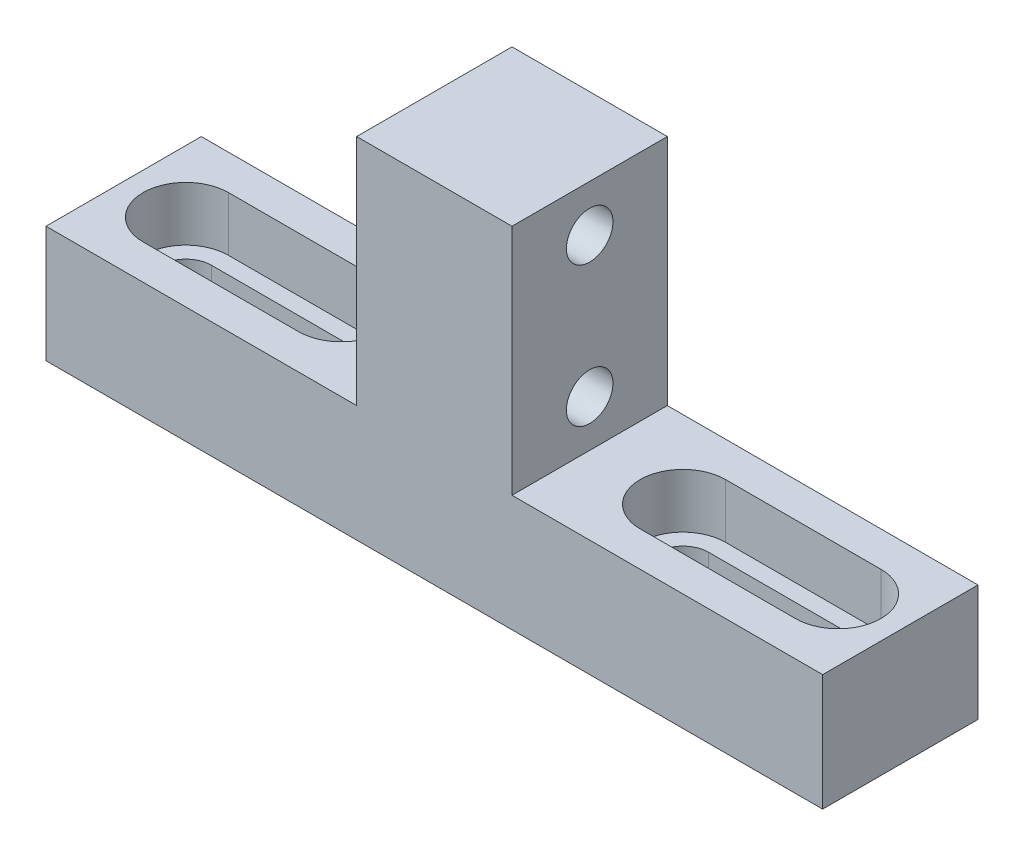
ISO-10303-21;
HEADER;
FILE_DESCRIPTION(('STEP AP214'),'2;1');
FILE_NAME('part.step','',(''),(''),'','','');
FILE_SCHEMA(('AUTOMOTIVE_DESIGN { 1 0 10303 214 1 1 1 1 }'));
ENDSEC;
DATA;
#1=APPLICATION_CONTEXT('core data for automotive mechanical design processes');
#2=APPLICATION_PROTOCOL_DEFINITION('international standard','automotive_design',2000,#1);
#3=PRODUCT_CONTEXT('',#1,'mechanical');
#4=PRODUCT('Part','Part','',(#3));
#5=PRODUCT_RELATED_PRODUCT_CATEGORY('part','',(#4));
#6=PRODUCT_DEFINITION_FORMATION('','',#4);
#7=PRODUCT_DEFINITION_CONTEXT('part definition',#1,'design');
#8=PRODUCT_DEFINITION('design','',#6,#7);
#9=PRODUCT_DEFINITION_SHAPE('','',#8);
#10=(LENGTH_UNIT() NAMED_UNIT(*) SI_UNIT(.MILLI.,.METRE.));
#11=(NAMED_UNIT(*) PLANE_ANGLE_UNIT() SI_UNIT($,.RADIAN.));
#12=(NAMED_UNIT(*) SI_UNIT($,.STERADIAN.) SOLID_ANGLE_UNIT());
#13=UNCERTAINTY_MEASURE_WITH_UNIT(LENGTH_MEASURE(1.E-05),#10,'distance_accuracy_value','');
#14=(GEOMETRIC_REPRESENTATION_CONTEXT(3) GLOBAL_UNCERTAINTY_ASSIGNED_CONTEXT((#13)) GLOBAL_UNIT_ASSIGNED_CONTEXT((#10,
#11,#12)) REPRESENTATION_CONTEXT('',''));
#15=CARTESIAN_POINT('',(0.,0.,0.));
#16=DIRECTION('',(0.,0.,1.));
#17=DIRECTION('',(1.,0.,0.));
#18=AXIS2_PLACEMENT_3D('',#15,#16,#17);
#19=CARTESIAN_POINT('',(0.,15.,0.));
#20=DIRECTION('',(0.,-1.,0.));
#21=DIRECTION('',(0.,0.,-1.));
#22=AXIS2_PLACEMENT_3D('',#19,#20,#21);
#23=PLANE('',#22);
#24=DIRECTION('',(0.,0.,-1.));
#25=VECTOR('',#24,1.);
#26=CARTESIAN_POINT('',(10.,15.,10.));
#27=LINE('',#26,#25);
#28=CARTESIAN_POINT('',(10.,15.,10.));
#29=VERTEX_POINT('',#28);
#30=CARTESIAN_POINT('',(10.,15.,-10.));
#31=VERTEX_POINT('',#30);
#32=EDGE_CURVE('E271',#29,#31,#27,.T.);
#33=ORIENTED_EDGE('',*,*,#32,.F.);
#34=DIRECTION('',(1.,0.,0.));
#35=VECTOR('',#34,1.);
#36=CARTESIAN_POINT('',(-50.,15.,10.));
#37=LINE('',#36,#35);
#38=CARTESIAN_POINT('',(50.,15.,10.));
#39=VERTEX_POINT('',#38);
#40=EDGE_CURVE('E360',#29,#39,#37,.T.);
#41=ORIENTED_EDGE('',*,*,#40,.T.);
#42=DIRECTION('',(0.,0.,-1.));
#43=VECTOR('',#42,1.);
#44=CARTESIAN_POINT('',(50.,15.,10.));
#45=LINE('',#44,#43);
#46=CARTESIAN_POINT('',(50.,15.,-10.));
#47=VERTEX_POINT('',#46);
#48=EDGE_CURVE('E343',#39,#47,#45,.T.);
#49=ORIENTED_EDGE('',*,*,#48,.T.);
#50=DIRECTION('',(-1.,0.,0.));
#51=VECTOR('',#50,1.);
#52=CARTESIAN_POINT('',(-50.,15.,-10.));
#53=LINE('',#52,#51);
#54=EDGE_CURVE('E352',#47,#31,#53,.T.);
#55=ORIENTED_EDGE('',*,*,#54,.T.);
#56=EDGE_LOOP('',(#33,#41,#49,#55));
#57=FACE_BOUND('',#56,.T.);
#58=CARTESIAN_POINT('',(22.,15.,0.));
#59=DIRECTION('',(0.,-1.,0.));
#60=DIRECTION('',(0.,0.,1.));
#61=AXIS2_PLACEMENT_3D('',#58,#59,#60);
#62=CIRCLE('',#61,5.5);
#63=CARTESIAN_POINT('',(22.,15.,5.5));
#64=VERTEX_POINT('',#63);
#65=CARTESIAN_POINT('',(22.,15.,-5.5));
#66=VERTEX_POINT('',#65);
#67=EDGE_CURVE('E34',#64,#66,#62,.T.);
#68=ORIENTED_EDGE('',*,*,#67,.T.);
#69=DIRECTION('',(1.,0.,0.));
#70=VECTOR('',#69,1.);
#71=CARTESIAN_POINT('',(22.,15.,-5.5));
#72=LINE('',#71,#70);
#73=CARTESIAN_POINT('',(42.,15.,-5.5));
#74=VERTEX_POINT('',#73);
#75=EDGE_CURVE('E497',#66,#74,#72,.T.);
#76=ORIENTED_EDGE('',*,*,#75,.T.);
#77=CARTESIAN_POINT('',(42.,15.,0.));
#78=DIRECTION('',(0.,-1.,0.));
#79=DIRECTION('',(0.,0.,1.));
#80=AXIS2_PLACEMENT_3D('',#77,#78,#79);
#81=CIRCLE('',#80,5.5);
#82=CARTESIAN_POINT('',(42.,15.,5.5));
#83=VERTEX_POINT('',#82);
#84=EDGE_CURVE('E501',#74,#83,#81,.T.);
#85=ORIENTED_EDGE('',*,*,#84,.T.);
#86=DIRECTION('',(-1.,0.,0.));
#87=VECTOR('',#86,1.);
#88=CARTESIAN_POINT('',(42.,15.,5.5));
#89=LINE('',#88,#87);
#90=EDGE_CURVE('E504',#83,#64,#89,.T.);
#91=ORIENTED_EDGE('',*,*,#90,.T.);
#92=EDGE_LOOP('',(#68,#76,#85,#91));
#93=FACE_BOUND('',#92,.T.);
#94=ADVANCED_FACE('F17',(#57,#93),#23,.F.);
#95=CARTESIAN_POINT('',(42.,0.,0.));
#96=DIRECTION('',(0.,1.,0.));
#97=DIRECTION('',(0.,0.,1.));
#98=AXIS2_PLACEMENT_3D('',#95,#96,#97);
#99=CYLINDRICAL_SURFACE('',#98,3.3);
#100=DIRECTION('',(0.,1.,0.));
#101=VECTOR('',#100,1.);
#102=CARTESIAN_POINT('',(42.,0.,3.3));
#103=LINE('',#102,#101);
#104=CARTESIAN_POINT('',(42.,0.,3.3));
#105=VERTEX_POINT('',#104);
#106=CARTESIAN_POINT('',(42.,8.,3.3));
#107=VERTEX_POINT('',#106);
#108=EDGE_CURVE('E202',#105,#107,#103,.T.);
#109=ORIENTED_EDGE('',*,*,#108,.T.);
#110=CARTESIAN_POINT('',(42.,8.,0.));
#111=DIRECTION('',(0.,-1.,0.));
#112=DIRECTION('',(0.,0.,1.));
#113=AXIS2_PLACEMENT_3D('',#110,#111,#112);
#114=CIRCLE('',#113,3.3);
#115=CARTESIAN_POINT('',(42.,8.,-3.3));
#116=VERTEX_POINT('',#115);
#117=EDGE_CURVE('E183',#116,#107,#114,.T.);
#118=ORIENTED_EDGE('',*,*,#117,.F.);
#119=DIRECTION('',(0.,1.,0.));
#120=VECTOR('',#119,1.);
#121=CARTESIAN_POINT('',(42.,0.,-3.3));
#122=LINE('',#121,#120);
#123=CARTESIAN_POINT('',(42.,0.,-3.3));
#124=VERTEX_POINT('',#123);
#125=EDGE_CURVE('E206',#124,#116,#122,.T.);
#126=ORIENTED_EDGE('',*,*,#125,.F.);
#127=CARTESIAN_POINT('',(42.,0.,0.));
#128=DIRECTION('',(0.,-1.,0.));
#129=DIRECTION('',(0.,0.,1.));
#130=AXIS2_PLACEMENT_3D('',#127,#128,#129);
#131=CIRCLE('',#130,3.3);
#132=EDGE_CURVE('E481',#124,#105,#131,.T.);
#133=ORIENTED_EDGE('',*,*,#132,.T.);
#134=EDGE_LOOP('',(#109,#118,#126,#133));
#135=FACE_BOUND('',#134,.T.);
#136=ADVANCED_FACE('F406',(#135),#99,.F.);
#137=CARTESIAN_POINT('',(42.,0.,3.3));
#138=DIRECTION('',(0.,0.,-1.));
#139=DIRECTION('',(-1.,0.,0.));
#140=AXIS2_PLACEMENT_3D('',#137,#138,#139);
#141=PLANE('',#140);
#142=DIRECTION('',(0.,1.,0.));
#143=VECTOR('',#142,1.);
#144=CARTESIAN_POINT('',(22.,0.,3.3));
#145=LINE('',#144,#143);
#146=CARTESIAN_POINT('',(22.,0.,3.3));
#147=VERTEX_POINT('',#146);
#148=CARTESIAN_POINT('',(22.,8.,3.3));
#149=VERTEX_POINT('',#148);
#150=EDGE_CURVE('E194',#147,#149,#145,.T.);
#151=ORIENTED_EDGE('',*,*,#150,.T.);
#152=DIRECTION('',(-1.,0.,0.));
#153=VECTOR('',#152,1.);
#154=CARTESIAN_POINT('',(42.,8.,3.3));
#155=LINE('',#154,#153);
#156=EDGE_CURVE('E180',#107,#149,#155,.T.);
#157=ORIENTED_EDGE('',*,*,#156,.F.);
#158=ORIENTED_EDGE('',*,*,#108,.F.);
#159=DIRECTION('',(-1.,0.,0.));
#160=VECTOR('',#159,1.);
#161=CARTESIAN_POINT('',(42.,0.,3.3));
#162=LINE('',#161,#160);
#163=EDGE_CURVE('E201',#105,#147,#162,.T.);
#164=ORIENTED_EDGE('',*,*,#163,.T.);
#165=EDGE_LOOP('',(#151,#157,#158,#164));
#166=FACE_BOUND('',#165,.T.);
#167=ADVANCED_FACE('F199',(#166),#141,.T.);
#168=CARTESIAN_POINT('',(22.,0.,0.));
#169=DIRECTION('',(0.,1.,0.));
#170=DIRECTION('',(0.,0.,1.));
#171=AXIS2_PLACEMENT_3D('',#168,#169,#170);
#172=CYLINDRICAL_SURFACE('',#171,3.3);
#173=DIRECTION('',(0.,1.,0.));
#174=VECTOR('',#173,1.);
#175=CARTESIAN_POINT('',(22.,0.,-3.3));
#176=LINE('',#175,#174);
#177=CARTESIAN_POINT('',(22.,0.,-3.3));
#178=VERTEX_POINT('',#177);
#179=CARTESIAN_POINT('',(22.,8.,-3.3));
#180=VERTEX_POINT('',#179);
#181=EDGE_CURVE('E196',#178,#180,#176,.T.);
#182=ORIENTED_EDGE('',*,*,#181,.T.);
#183=CARTESIAN_POINT('',(22.,8.,0.));
#184=DIRECTION('',(0.,-1.,0.));
#185=DIRECTION('',(0.,0.,1.));
#186=AXIS2_PLACEMENT_3D('',#183,#184,#185);
#187=CIRCLE('',#186,3.3);
#188=EDGE_CURVE('E42',#149,#180,#187,.T.);
#189=ORIENTED_EDGE('',*,*,#188,.F.);
#190=ORIENTED_EDGE('',*,*,#150,.F.);
#191=CARTESIAN_POINT('',(22.,0.,0.));
#192=DIRECTION('',(0.,-1.,0.));
#193=DIRECTION('',(0.,0.,1.));
#194=AXIS2_PLACEMENT_3D('',#191,#192,#193);
#195=CIRCLE('',#194,3.3);
#196=EDGE_CURVE('E482',#147,#178,#195,.T.);
#197=ORIENTED_EDGE('',*,*,#196,.T.);
#198=EDGE_LOOP('',(#182,#189,#190,#197));
#199=FACE_BOUND('',#198,.T.);
#200=ADVANCED_FACE('F192',(#199),#172,.F.);
#201=CARTESIAN_POINT('',(42.,0.,-3.3));
#202=DIRECTION('',(0.,0.,1.));
#203=DIRECTION('',(1.,0.,0.));
#204=AXIS2_PLACEMENT_3D('',#201,#202,#203);
#205=PLANE('',#204);
#206=ORIENTED_EDGE('',*,*,#125,.T.);
#207=DIRECTION('',(1.,0.,0.));
#208=VECTOR('',#207,1.);
#209=CARTESIAN_POINT('',(22.,8.,-3.3));
#210=LINE('',#209,#208);
#211=EDGE_CURVE('E508',#180,#116,#210,.T.);
#212=ORIENTED_EDGE('',*,*,#211,.F.);
#213=ORIENTED_EDGE('',*,*,#181,.F.);
#214=DIRECTION('',(1.,0.,0.));
#215=VECTOR('',#214,1.);
#216=CARTESIAN_POINT('',(42.,0.,-3.3));
#217=LINE('',#216,#215);
#218=EDGE_CURVE('E483',#178,#124,#217,.T.);
#219=ORIENTED_EDGE('',*,*,#218,.T.);
#220=EDGE_LOOP('',(#206,#212,#213,#219));
#221=FACE_BOUND('',#220,.T.);
#222=ADVANCED_FACE('F473',(#221),#205,.T.);
#223=CARTESIAN_POINT('',(0.,0.,0.));
#224=DIRECTION('',(0.,-1.,0.));
#225=DIRECTION('',(0.,0.,-1.));
#226=AXIS2_PLACEMENT_3D('',#223,#224,#225);
#227=PLANE('',#226);
#228=DIRECTION('',(0.,0.,-1.));
#229=VECTOR('',#228,1.);
#230=CARTESIAN_POINT('',(50.,0.,10.));
#231=LINE('',#230,#229);
#232=CARTESIAN_POINT('',(50.,0.,10.));
#233=VERTEX_POINT('',#232);
#234=CARTESIAN_POINT('',(50.,0.,-10.));
#235=VERTEX_POINT('',#234);
#236=EDGE_CURVE('E324',#233,#235,#231,.T.);
#237=ORIENTED_EDGE('',*,*,#236,.F.);
#238=DIRECTION('',(1.,0.,0.));
#239=VECTOR('',#238,1.);
#240=CARTESIAN_POINT('',(-50.,0.,10.));
#241=LINE('',#240,#239);
#242=CARTESIAN_POINT('',(-50.,0.,10.));
#243=VERTEX_POINT('',#242);
#244=EDGE_CURVE('E341',#243,#233,#241,.T.);
#245=ORIENTED_EDGE('',*,*,#244,.F.);
#246=DIRECTION('',(0.,0.,1.));
#247=VECTOR('',#246,1.);
#248=CARTESIAN_POINT('',(-50.,0.,10.));
#249=LINE('',#248,#247);
#250=CARTESIAN_POINT('',(-50.,0.,-10.));
#251=VERTEX_POINT('',#250);
#252=EDGE_CURVE('E334',#251,#243,#249,.T.);
#253=ORIENTED_EDGE('',*,*,#252,.F.);
#254=DIRECTION('',(-1.,0.,0.));
#255=VECTOR('',#254,1.);
#256=CARTESIAN_POINT('',(-50.,0.,-10.));
#257=LINE('',#256,#255);
#258=EDGE_CURVE('E328',#235,#251,#257,.T.);
#259=ORIENTED_EDGE('',*,*,#258,.F.);
#260=EDGE_LOOP('',(#237,#245,#253,#259));
#261=FACE_BOUND('',#260,.T.);
#262=CARTESIAN_POINT('',(-42.,0.,0.));
#263=DIRECTION('',(0.,1.,0.));
#264=DIRECTION('',(0.,0.,1.));
#265=AXIS2_PLACEMENT_3D('',#262,#263,#264);
#266=CIRCLE('',#265,3.3);
#267=CARTESIAN_POINT('',(-42.,0.,-3.3));
#268=VERTEX_POINT('',#267);
#269=CARTESIAN_POINT('',(-42.,0.,3.3));
#270=VERTEX_POINT('',#269);
#271=EDGE_CURVE('E249',#268,#270,#266,.T.);
#272=ORIENTED_EDGE('',*,*,#271,.T.);
#273=DIRECTION('',(1.,0.,0.));
#274=VECTOR('',#273,1.);
#275=CARTESIAN_POINT('',(-42.,0.,3.3));
#276=LINE('',#275,#274);
#277=CARTESIAN_POINT('',(-22.,0.,3.3));
#278=VERTEX_POINT('',#277);
#279=EDGE_CURVE('E258',#270,#278,#276,.T.);
#280=ORIENTED_EDGE('',*,*,#279,.T.);
#281=CARTESIAN_POINT('',(-22.,0.,0.));
#282=DIRECTION('',(0.,1.,0.));
#283=DIRECTION('',(0.,0.,1.));
#284=AXIS2_PLACEMENT_3D('',#281,#282,#283);
#285=CIRCLE('',#284,3.3);
#286=CARTESIAN_POINT('',(-22.,0.,-3.3));
#287=VERTEX_POINT('',#286);
#288=EDGE_CURVE('E261',#278,#287,#285,.T.);
#289=ORIENTED_EDGE('',*,*,#288,.T.);
#290=DIRECTION('',(-1.,0.,0.));
#291=VECTOR('',#290,1.);
#292=CARTESIAN_POINT('',(-42.,0.,-3.3));
#293=LINE('',#292,#291);
#294=EDGE_CURVE('E264',#287,#268,#293,.T.);
#295=ORIENTED_EDGE('',*,*,#294,.T.);
#296=EDGE_LOOP('',(#272,#280,#289,#295));
#297=FACE_BOUND('',#296,.T.);
#298=ORIENTED_EDGE('',*,*,#163,.F.);
#299=ORIENTED_EDGE('',*,*,#132,.F.);
#300=ORIENTED_EDGE('',*,*,#218,.F.);
#301=ORIENTED_EDGE('',*,*,#196,.F.);
#302=EDGE_LOOP('',(#298,#299,#300,#301));
#303=FACE_BOUND('',#302,.T.);
#304=ADVANCED_FACE('F384',(#261,#297,#303),#227,.T.);
#305=CARTESIAN_POINT('',(-42.,0.,0.));
#306=DIRECTION('',(0.,1.,0.));
#307=DIRECTION('',(0.,0.,1.));
#308=AXIS2_PLACEMENT_3D('',#305,#306,#307);
#309=CYLINDRICAL_SURFACE('',#308,3.3);
#310=CARTESIAN_POINT('',(-42.,8.,0.));
#311=DIRECTION('',(0.,1.,0.));
#312=DIRECTION('',(0.,0.,1.));
#313=AXIS2_PLACEMENT_3D('',#310,#311,#312);
#314=CIRCLE('',#313,3.3);
#315=CARTESIAN_POINT('',(-42.,8.,-3.3));
#316=VERTEX_POINT('',#315);
#317=CARTESIAN_POINT('',(-42.,8.,3.3));
#318=VERTEX_POINT('',#317);
#319=EDGE_CURVE('E217',#316,#318,#314,.T.);
#320=ORIENTED_EDGE('',*,*,#319,.T.);
#321=DIRECTION('',(0.,1.,0.));
#322=VECTOR('',#321,1.);
#323=CARTESIAN_POINT('',(-42.,0.,3.3));
#324=LINE('',#323,#322);
#325=EDGE_CURVE('E267',#270,#318,#324,.T.);
#326=ORIENTED_EDGE('',*,*,#325,.F.);
#327=ORIENTED_EDGE('',*,*,#271,.F.);
#328=DIRECTION('',(0.,1.,0.));
#329=VECTOR('',#328,1.);
#330=CARTESIAN_POINT('',(-42.,0.,-3.3));
#331=LINE('',#330,#329);
#332=EDGE_CURVE('E268',#268,#316,#331,.T.);
#333=ORIENTED_EDGE('',*,*,#332,.T.);
#334=EDGE_LOOP('',(#320,#326,#327,#333));
#335=FACE_BOUND('',#334,.T.);
#336=ADVANCED_FACE('F463',(#335),#309,.F.);
#337=CARTESIAN_POINT('',(-42.,0.,-3.3));
#338=DIRECTION('',(0.,0.,-1.));
#339=DIRECTION('',(-1.,0.,0.));
#340=AXIS2_PLACEMENT_3D('',#337,#338,#339);
#341=PLANE('',#340);
#342=DIRECTION('',(-1.,0.,0.));
#343=VECTOR('',#342,1.);
#344=CARTESIAN_POINT('',(-22.,8.,-3.3));
#345=LINE('',#344,#343);
#346=CARTESIAN_POINT('',(-22.,8.,-3.3));
#347=VERTEX_POINT('',#346);
#348=EDGE_CURVE('E214',#347,#316,#345,.T.);
#349=ORIENTED_EDGE('',*,*,#348,.T.);
#350=ORIENTED_EDGE('',*,*,#332,.F.);
#351=ORIENTED_EDGE('',*,*,#294,.F.);
#352=DIRECTION('',(0.,1.,0.));
#353=VECTOR('',#352,1.);
#354=CARTESIAN_POINT('',(-22.,0.,-3.3));
#355=LINE('',#354,#353);
#356=EDGE_CURVE('E272',#287,#347,#355,.T.);
#357=ORIENTED_EDGE('',*,*,#356,.T.);
#358=EDGE_LOOP('',(#349,#350,#351,#357));
#359=FACE_BOUND('',#358,.T.);
#360=ADVANCED_FACE('F460',(#359),#341,.F.);
#361=CARTESIAN_POINT('',(-22.,0.,0.));
#362=DIRECTION('',(0.,1.,0.));
#363=DIRECTION('',(0.,0.,1.));
#364=AXIS2_PLACEMENT_3D('',#361,#362,#363);
#365=CYLINDRICAL_SURFACE('',#364,3.3);
#366=CARTESIAN_POINT('',(-22.,8.,0.));
#367=DIRECTION('',(0.,1.,0.));
#368=DIRECTION('',(0.,0.,1.));
#369=AXIS2_PLACEMENT_3D('',#366,#367,#368);
#370=CIRCLE('',#369,3.3);
#371=CARTESIAN_POINT('',(-22.,8.,3.3));
#372=VERTEX_POINT('',#371);
#373=EDGE_CURVE('E204',#372,#347,#370,.T.);
#374=ORIENTED_EDGE('',*,*,#373,.T.);
#375=ORIENTED_EDGE('',*,*,#356,.F.);
#376=ORIENTED_EDGE('',*,*,#288,.F.);
#377=DIRECTION('',(0.,1.,0.));
#378=VECTOR('',#377,1.);
#379=CARTESIAN_POINT('',(-22.,0.,3.3));
#380=LINE('',#379,#378);
#381=EDGE_CURVE('E275',#278,#372,#380,.T.);
#382=ORIENTED_EDGE('',*,*,#381,.T.);
#383=EDGE_LOOP('',(#374,#375,#376,#382));
#384=FACE_BOUND('',#383,.T.);
#385=ADVANCED_FACE('F424',(#384),#365,.F.);
#386=CARTESIAN_POINT('',(-42.,0.,3.3));
#387=DIRECTION('',(0.,0.,1.));
#388=DIRECTION('',(1.,0.,0.));
#389=AXIS2_PLACEMENT_3D('',#386,#387,#388);
#390=PLANE('',#389);
#391=DIRECTION('',(1.,0.,0.));
#392=VECTOR('',#391,1.);
#393=CARTESIAN_POINT('',(-42.,8.,3.3));
#394=LINE('',#393,#392);
#395=EDGE_CURVE('E220',#318,#372,#394,.T.);
#396=ORIENTED_EDGE('',*,*,#395,.T.);
#397=ORIENTED_EDGE('',*,*,#381,.F.);
#398=ORIENTED_EDGE('',*,*,#279,.F.);
#399=ORIENTED_EDGE('',*,*,#325,.T.);
#400=EDGE_LOOP('',(#396,#397,#398,#399));
#401=FACE_BOUND('',#400,.T.);
#402=ADVANCED_FACE('F417',(#401),#390,.F.);
#403=DIRECTION('',(-1.,0.,0.));
#404=VECTOR('',#403,1.);
#405=CARTESIAN_POINT('',(-22.,15.,-5.5));
#406=LINE('',#405,#404);
#407=CARTESIAN_POINT('',(-22.,15.,-5.5));
#408=VERTEX_POINT('',#407);
#409=CARTESIAN_POINT('',(-42.,15.,-5.5));
#410=VERTEX_POINT('',#409);
#411=EDGE_CURVE('E239',#408,#410,#406,.T.);
#412=ORIENTED_EDGE('',*,*,#411,.F.);
#413=CARTESIAN_POINT('',(-22.,15.,0.));
#414=DIRECTION('',(0.,1.,0.));
#415=DIRECTION('',(0.,0.,1.));
#416=AXIS2_PLACEMENT_3D('',#413,#414,#415);
#417=CIRCLE('',#416,5.5);
#418=CARTESIAN_POINT('',(-22.,15.,5.5));
#419=VERTEX_POINT('',#418);
#420=EDGE_CURVE('E223',#419,#408,#417,.T.);
#421=ORIENTED_EDGE('',*,*,#420,.F.);
#422=DIRECTION('',(1.,0.,0.));
#423=VECTOR('',#422,1.);
#424=CARTESIAN_POINT('',(-42.,15.,5.5));
#425=LINE('',#424,#423);
#426=CARTESIAN_POINT('',(-42.,15.,5.5));
#427=VERTEX_POINT('',#426);
#428=EDGE_CURVE('E228',#427,#419,#425,.T.);
#429=ORIENTED_EDGE('',*,*,#428,.F.);
#430=CARTESIAN_POINT('',(-42.,15.,0.));
#431=DIRECTION('',(0.,1.,0.));
#432=DIRECTION('',(0.,0.,1.));
#433=AXIS2_PLACEMENT_3D('',#430,#431,#432);
#434=CIRCLE('',#433,5.5);
#435=EDGE_CURVE('E242',#410,#427,#434,.T.);
#436=ORIENTED_EDGE('',*,*,#435,.F.);
#437=EDGE_LOOP('',(#412,#421,#429,#436));
#438=FACE_BOUND('',#437,.T.);
#439=DIRECTION('',(0.,0.,1.));
#440=VECTOR('',#439,1.);
#441=CARTESIAN_POINT('',(-10.,15.,10.));
#442=LINE('',#441,#440);
#443=CARTESIAN_POINT('',(-10.,15.,-10.));
#444=VERTEX_POINT('',#443);
#445=CARTESIAN_POINT('',(-10.,15.,10.));
#446=VERTEX_POINT('',#445);
#447=EDGE_CURVE('E284',#444,#446,#442,.T.);
#448=ORIENTED_EDGE('',*,*,#447,.F.);
#449=CARTESIAN_POINT('',(-50.,15.,-10.));
#450=VERTEX_POINT('',#449);
#451=EDGE_CURVE('E356',#444,#450,#53,.T.);
#452=ORIENTED_EDGE('',*,*,#451,.T.);
#453=DIRECTION('',(0.,0.,1.));
#454=VECTOR('',#453,1.);
#455=CARTESIAN_POINT('',(-50.,15.,10.));
#456=LINE('',#455,#454);
#457=CARTESIAN_POINT('',(-50.,15.,10.));
#458=VERTEX_POINT('',#457);
#459=EDGE_CURVE('E355',#450,#458,#456,.T.);
#460=ORIENTED_EDGE('',*,*,#459,.T.);
#461=EDGE_CURVE('E347',#458,#446,#37,.T.);
#462=ORIENTED_EDGE('',*,*,#461,.T.);
#463=EDGE_LOOP('',(#448,#452,#460,#462));
#464=FACE_BOUND('',#463,.T.);
#465=ADVANCED_FACE('F369',(#438,#464),#23,.F.);
#466=CARTESIAN_POINT('',(50.,15.,10.));
#467=DIRECTION('',(-1.,0.,0.));
#468=DIRECTION('',(0.,0.,1.));
#469=AXIS2_PLACEMENT_3D('',#466,#467,#468);
#470=PLANE('',#469);
#471=ORIENTED_EDGE('',*,*,#236,.T.);
#472=DIRECTION('',(0.,-1.,0.));
#473=VECTOR('',#472,1.);
#474=CARTESIAN_POINT('',(50.,15.,-10.));
#475=LINE('',#474,#473);
#476=EDGE_CURVE('E11',#47,#235,#475,.T.);
#477=ORIENTED_EDGE('',*,*,#476,.F.);
#478=ORIENTED_EDGE('',*,*,#48,.F.);
#479=DIRECTION('',(0.,-1.,0.));
#480=VECTOR('',#479,1.);
#481=CARTESIAN_POINT('',(50.,15.,10.));
#482=LINE('',#481,#480);
#483=EDGE_CURVE('E344',#39,#233,#482,.T.);
#484=ORIENTED_EDGE('',*,*,#483,.T.);
#485=EDGE_LOOP('',(#471,#477,#478,#484));
#486=FACE_BOUND('',#485,.T.);
#487=ADVANCED_FACE('F19',(#486),#470,.F.);
#488=CARTESIAN_POINT('',(-50.,15.,-10.));
#489=DIRECTION('',(0.,0.,1.));
#490=DIRECTION('',(1.,0.,0.));
#491=AXIS2_PLACEMENT_3D('',#488,#489,#490);
#492=PLANE('',#491);
#493=ORIENTED_EDGE('',*,*,#258,.T.);
#494=DIRECTION('',(0.,-1.,0.));
#495=VECTOR('',#494,1.);
#496=CARTESIAN_POINT('',(-50.,15.,-10.));
#497=LINE('',#496,#495);
#498=EDGE_CURVE('E26',#450,#251,#497,.T.);
#499=ORIENTED_EDGE('',*,*,#498,.F.);
#500=ORIENTED_EDGE('',*,*,#451,.F.);
#501=DIRECTION('',(0.,-1.,0.));
#502=VECTOR('',#501,1.);
#503=CARTESIAN_POINT('',(-10.,45.,-10.));
#504=LINE('',#503,#502);
#505=CARTESIAN_POINT('',(-10.,45.,-10.));
#506=VERTEX_POINT('',#505);
#507=EDGE_CURVE('E308',#506,#444,#504,.T.);
#508=ORIENTED_EDGE('',*,*,#507,.F.);
#509=DIRECTION('',(-1.,0.,0.));
#510=VECTOR('',#509,1.);
#511=CARTESIAN_POINT('',(-10.,45.,-10.));
#512=LINE('',#511,#510);
#513=CARTESIAN_POINT('',(10.,45.,-10.));
#514=VERTEX_POINT('',#513);
#515=EDGE_CURVE('E283',#514,#506,#512,.T.);
#516=ORIENTED_EDGE('',*,*,#515,.F.);
#517=DIRECTION('',(0.,-1.,0.));
#518=VECTOR('',#517,1.);
#519=CARTESIAN_POINT('',(10.,45.,-10.));
#520=LINE('',#519,#518);
#521=EDGE_CURVE('E315',#514,#31,#520,.T.);
#522=ORIENTED_EDGE('',*,*,#521,.T.);
#523=ORIENTED_EDGE('',*,*,#54,.F.);
#524=ORIENTED_EDGE('',*,*,#476,.T.);
#525=EDGE_LOOP('',(#493,#499,#500,#508,#516,#522,#523,#524));
#526=FACE_BOUND('',#525,.T.);
#527=ADVANCED_FACE('F375',(#526),#492,.F.);
#528=CARTESIAN_POINT('',(-50.,15.,10.));
#529=DIRECTION('',(1.,0.,0.));
#530=DIRECTION('',(0.,0.,-1.));
#531=AXIS2_PLACEMENT_3D('',#528,#529,#530);
#532=PLANE('',#531);
#533=ORIENTED_EDGE('',*,*,#252,.T.);
#534=DIRECTION('',(0.,-1.,0.));
#535=VECTOR('',#534,1.);
#536=CARTESIAN_POINT('',(-50.,15.,10.));
#537=LINE('',#536,#535);
#538=EDGE_CURVE('E346',#458,#243,#537,.T.);
#539=ORIENTED_EDGE('',*,*,#538,.F.);
#540=ORIENTED_EDGE('',*,*,#459,.F.);
#541=ORIENTED_EDGE('',*,*,#498,.T.);
#542=EDGE_LOOP('',(#533,#539,#540,#541));
#543=FACE_BOUND('',#542,.T.);
#544=ADVANCED_FACE('F382',(#543),#532,.F.);
#545=CARTESIAN_POINT('',(-50.,15.,10.));
#546=DIRECTION('',(0.,0.,-1.));
#547=DIRECTION('',(-1.,0.,0.));
#548=AXIS2_PLACEMENT_3D('',#545,#546,#547);
#549=PLANE('',#548);
#550=ORIENTED_EDGE('',*,*,#244,.T.);
#551=ORIENTED_EDGE('',*,*,#483,.F.);
#552=ORIENTED_EDGE('',*,*,#40,.F.);
#553=DIRECTION('',(0.,-1.,0.));
#554=VECTOR('',#553,1.);
#555=CARTESIAN_POINT('',(10.,45.,10.));
#556=LINE('',#555,#554);
#557=CARTESIAN_POINT('',(10.,45.,10.));
#558=VERTEX_POINT('',#557);
#559=EDGE_CURVE('E290',#558,#29,#556,.T.);
#560=ORIENTED_EDGE('',*,*,#559,.F.);
#561=DIRECTION('',(1.,0.,0.));
#562=VECTOR('',#561,1.);
#563=CARTESIAN_POINT('',(-10.,45.,10.));
#564=LINE('',#563,#562);
#565=CARTESIAN_POINT('',(-10.,45.,10.));
#566=VERTEX_POINT('',#565);
#567=EDGE_CURVE('E288',#566,#558,#564,.T.);
#568=ORIENTED_EDGE('',*,*,#567,.F.);
#569=DIRECTION('',(0.,-1.,0.));
#570=VECTOR('',#569,1.);
#571=CARTESIAN_POINT('',(-10.,45.,10.));
#572=LINE('',#571,#570);
#573=EDGE_CURVE('E302',#566,#446,#572,.T.);
#574=ORIENTED_EDGE('',*,*,#573,.T.);
#575=ORIENTED_EDGE('',*,*,#461,.F.);
#576=ORIENTED_EDGE('',*,*,#538,.T.);
#577=EDGE_LOOP('',(#550,#551,#552,#560,#568,#574,#575,#576));
#578=FACE_BOUND('',#577,.T.);
#579=ADVANCED_FACE('F386',(#578),#549,.F.);
#580=CARTESIAN_POINT('',(10.,45.,10.));
#581=DIRECTION('',(-1.,0.,0.));
#582=DIRECTION('',(0.,0.,1.));
#583=AXIS2_PLACEMENT_3D('',#580,#581,#582);
#584=PLANE('',#583);
#585=CARTESIAN_POINT('',(10.,39.,0.));
#586=DIRECTION('',(-1.,0.,0.));
#587=DIRECTION('',(0.,0.,1.));
#588=AXIS2_PLACEMENT_3D('',#585,#586,#587);
#589=CIRCLE('',#588,3.);
#590=CARTESIAN_POINT('',(10.,39.,3.));
#591=VERTEX_POINT('',#590);
#592=EDGE_CURVE('E21',#591,#591,#589,.T.);
#593=ORIENTED_EDGE('',*,*,#592,.T.);
#594=EDGE_LOOP('',(#593));
#595=FACE_BOUND('',#594,.T.);
#596=CARTESIAN_POINT('',(10.,21.,0.));
#597=DIRECTION('',(-1.,0.,0.));
#598=DIRECTION('',(0.,0.,1.));
#599=AXIS2_PLACEMENT_3D('',#596,#597,#598);
#600=CIRCLE('',#599,3.);
#601=CARTESIAN_POINT('',(10.,21.,3.));
#602=VERTEX_POINT('',#601);
#603=EDGE_CURVE('E197',#602,#602,#600,.T.);
#604=ORIENTED_EDGE('',*,*,#603,.T.);
#605=EDGE_LOOP('',(#604));
#606=FACE_BOUND('',#605,.T.);
#607=ORIENTED_EDGE('',*,*,#32,.T.);
#608=ORIENTED_EDGE('',*,*,#521,.F.);
#609=DIRECTION('',(0.,0.,-1.));
#610=VECTOR('',#609,1.);
#611=CARTESIAN_POINT('',(10.,45.,10.));
#612=LINE('',#611,#610);
#613=EDGE_CURVE('E280',#558,#514,#612,.T.);
#614=ORIENTED_EDGE('',*,*,#613,.F.);
#615=ORIENTED_EDGE('',*,*,#559,.T.);
#616=EDGE_LOOP('',(#607,#608,#614,#615));
#617=FACE_BOUND('',#616,.T.);
#618=ADVANCED_FACE('F387',(#595,#606,#617),#584,.F.);
#619=CARTESIAN_POINT('',(-10.,45.,10.));
#620=DIRECTION('',(1.,0.,0.));
#621=DIRECTION('',(0.,0.,-1.));
#622=AXIS2_PLACEMENT_3D('',#619,#620,#621);
#623=PLANE('',#622);
#624=CARTESIAN_POINT('',(-10.,39.,0.));
#625=DIRECTION('',(-1.,0.,0.));
#626=DIRECTION('',(0.,0.,1.));
#627=AXIS2_PLACEMENT_3D('',#624,#625,#626);
#628=CIRCLE('',#627,3.);
#629=CARTESIAN_POINT('',(-10.,39.,3.));
#630=VERTEX_POINT('',#629);
#631=EDGE_CURVE('E523',#630,#630,#628,.T.);
#632=ORIENTED_EDGE('',*,*,#631,.F.);
#633=EDGE_LOOP('',(#632));
#634=FACE_BOUND('',#633,.T.);
#635=CARTESIAN_POINT('',(-10.,21.,0.));
#636=DIRECTION('',(-1.,0.,0.));
#637=DIRECTION('',(0.,0.,1.));
#638=AXIS2_PLACEMENT_3D('',#635,#636,#637);
#639=CIRCLE('',#638,3.);
#640=CARTESIAN_POINT('',(-10.,21.,3.));
#641=VERTEX_POINT('',#640);
#642=EDGE_CURVE('E520',#641,#641,#639,.T.);
#643=ORIENTED_EDGE('',*,*,#642,.F.);
#644=EDGE_LOOP('',(#643));
#645=FACE_BOUND('',#644,.T.);
#646=ORIENTED_EDGE('',*,*,#447,.T.);
#647=ORIENTED_EDGE('',*,*,#573,.F.);
#648=DIRECTION('',(0.,0.,1.));
#649=VECTOR('',#648,1.);
#650=CARTESIAN_POINT('',(-10.,45.,10.));
#651=LINE('',#650,#649);
#652=EDGE_CURVE('E286',#506,#566,#651,.T.);
#653=ORIENTED_EDGE('',*,*,#652,.F.);
#654=ORIENTED_EDGE('',*,*,#507,.T.);
#655=EDGE_LOOP('',(#646,#647,#653,#654));
#656=FACE_BOUND('',#655,.T.);
#657=ADVANCED_FACE('F372',(#634,#645,#656),#623,.F.);
#658=CARTESIAN_POINT('',(0.,45.,0.));
#659=DIRECTION('',(0.,-1.,0.));
#660=DIRECTION('',(0.,0.,-1.));
#661=AXIS2_PLACEMENT_3D('',#658,#659,#660);
#662=PLANE('',#661);
#663=ORIENTED_EDGE('',*,*,#613,.T.);
#664=ORIENTED_EDGE('',*,*,#515,.T.);
#665=ORIENTED_EDGE('',*,*,#652,.T.);
#666=ORIENTED_EDGE('',*,*,#567,.T.);
#667=EDGE_LOOP('',(#663,#664,#665,#666));
#668=FACE_BOUND('',#667,.T.);
#669=ADVANCED_FACE('F389',(#668),#662,.F.);
#670=CARTESIAN_POINT('',(-22.,8.,0.));
#671=DIRECTION('',(0.,1.,0.));
#672=DIRECTION('',(0.,0.,1.));
#673=AXIS2_PLACEMENT_3D('',#670,#671,#672);
#674=CYLINDRICAL_SURFACE('',#673,5.5);
#675=ORIENTED_EDGE('',*,*,#420,.T.);
#676=DIRECTION('',(0.,1.,0.));
#677=VECTOR('',#676,1.);
#678=CARTESIAN_POINT('',(-22.,8.,-5.5));
#679=LINE('',#678,#677);
#680=CARTESIAN_POINT('',(-22.,8.,-5.5));
#681=VERTEX_POINT('',#680);
#682=EDGE_CURVE('E237',#681,#408,#679,.T.);
#683=ORIENTED_EDGE('',*,*,#682,.F.);
#684=CARTESIAN_POINT('',(-22.,8.,0.));
#685=DIRECTION('',(0.,1.,0.));
#686=DIRECTION('',(0.,0.,1.));
#687=AXIS2_PLACEMENT_3D('',#684,#685,#686);
#688=CIRCLE('',#687,5.5);
#689=CARTESIAN_POINT('',(-22.,8.,5.5));
#690=VERTEX_POINT('',#689);
#691=EDGE_CURVE('E224',#690,#681,#688,.T.);
#692=ORIENTED_EDGE('',*,*,#691,.F.);
#693=DIRECTION('',(0.,1.,0.));
#694=VECTOR('',#693,1.);
#695=CARTESIAN_POINT('',(-22.,8.,5.5));
#696=LINE('',#695,#694);
#697=EDGE_CURVE('E247',#690,#419,#696,.T.);
#698=ORIENTED_EDGE('',*,*,#697,.T.);
#699=EDGE_LOOP('',(#675,#683,#692,#698));
#700=FACE_BOUND('',#699,.T.);
#701=ADVANCED_FACE('F391',(#700),#674,.F.);
#702=CARTESIAN_POINT('',(-42.,8.,5.5));
#703=DIRECTION('',(0.,0.,1.));
#704=DIRECTION('',(1.,0.,0.));
#705=AXIS2_PLACEMENT_3D('',#702,#703,#704);
#706=PLANE('',#705);
#707=ORIENTED_EDGE('',*,*,#428,.T.);
#708=ORIENTED_EDGE('',*,*,#697,.F.);
#709=DIRECTION('',(1.,0.,0.));
#710=VECTOR('',#709,1.);
#711=CARTESIAN_POINT('',(-42.,8.,5.5));
#712=LINE('',#711,#710);
#713=CARTESIAN_POINT('',(-42.,8.,5.5));
#714=VERTEX_POINT('',#713);
#715=EDGE_CURVE('E234',#714,#690,#712,.T.);
#716=ORIENTED_EDGE('',*,*,#715,.F.);
#717=DIRECTION('',(0.,1.,0.));
#718=VECTOR('',#717,1.);
#719=CARTESIAN_POINT('',(-42.,8.,5.5));
#720=LINE('',#719,#718);
#721=EDGE_CURVE('E250',#714,#427,#720,.T.);
#722=ORIENTED_EDGE('',*,*,#721,.T.);
#723=EDGE_LOOP('',(#707,#708,#716,#722));
#724=FACE_BOUND('',#723,.T.);
#725=ADVANCED_FACE('F399',(#724),#706,.F.);
#726=CARTESIAN_POINT('',(-42.,8.,0.));
#727=DIRECTION('',(0.,1.,0.));
#728=DIRECTION('',(0.,0.,1.));
#729=AXIS2_PLACEMENT_3D('',#726,#727,#728);
#730=CYLINDRICAL_SURFACE('',#729,5.5);
#731=ORIENTED_EDGE('',*,*,#435,.T.);
#732=ORIENTED_EDGE('',*,*,#721,.F.);
#733=CARTESIAN_POINT('',(-42.,8.,0.));
#734=DIRECTION('',(0.,1.,0.));
#735=DIRECTION('',(0.,0.,1.));
#736=AXIS2_PLACEMENT_3D('',#733,#734,#735);
#737=CIRCLE('',#736,5.5);
#738=CARTESIAN_POINT('',(-42.,8.,-5.5));
#739=VERTEX_POINT('',#738);
#740=EDGE_CURVE('E231',#739,#714,#737,.T.);
#741=ORIENTED_EDGE('',*,*,#740,.F.);
#742=DIRECTION('',(0.,1.,0.));
#743=VECTOR('',#742,1.);
#744=CARTESIAN_POINT('',(-42.,8.,-5.5));
#745=LINE('',#744,#743);
#746=EDGE_CURVE('E252',#739,#410,#745,.T.);
#747=ORIENTED_EDGE('',*,*,#746,.T.);
#748=EDGE_LOOP('',(#731,#732,#741,#747));
#749=FACE_BOUND('',#748,.T.);
#750=ADVANCED_FACE('F439',(#749),#730,.F.);
#751=CARTESIAN_POINT('',(-22.,8.,-5.5));
#752=DIRECTION('',(0.,0.,-1.));
#753=DIRECTION('',(-1.,0.,0.));
#754=AXIS2_PLACEMENT_3D('',#751,#752,#753);
#755=PLANE('',#754);
#756=ORIENTED_EDGE('',*,*,#411,.T.);
#757=ORIENTED_EDGE('',*,*,#746,.F.);
#758=DIRECTION('',(-1.,0.,0.));
#759=VECTOR('',#758,1.);
#760=CARTESIAN_POINT('',(-22.,8.,-5.5));
#761=LINE('',#760,#759);
#762=EDGE_CURVE('E227',#681,#739,#761,.T.);
#763=ORIENTED_EDGE('',*,*,#762,.F.);
#764=ORIENTED_EDGE('',*,*,#682,.T.);
#765=EDGE_LOOP('',(#756,#757,#763,#764));
#766=FACE_BOUND('',#765,.T.);
#767=ADVANCED_FACE('F432',(#766),#755,.F.);
#768=CARTESIAN_POINT('',(-22.,8.,0.));
#769=DIRECTION('',(0.,1.,0.));
#770=DIRECTION('',(0.,0.,1.));
#771=AXIS2_PLACEMENT_3D('',#768,#769,#770);
#772=PLANE('',#771);
#773=ORIENTED_EDGE('',*,*,#395,.F.);
#774=ORIENTED_EDGE('',*,*,#319,.F.);
#775=ORIENTED_EDGE('',*,*,#348,.F.);
#776=ORIENTED_EDGE('',*,*,#373,.F.);
#777=EDGE_LOOP('',(#773,#774,#775,#776));
#778=FACE_BOUND('',#777,.T.);
#779=ORIENTED_EDGE('',*,*,#691,.T.);
#780=ORIENTED_EDGE('',*,*,#762,.T.);
#781=ORIENTED_EDGE('',*,*,#740,.T.);
#782=ORIENTED_EDGE('',*,*,#715,.T.);
#783=EDGE_LOOP('',(#779,#780,#781,#782));
#784=FACE_BOUND('',#783,.T.);
#785=ADVANCED_FACE('F441',(#778,#784),#772,.T.);
#786=CARTESIAN_POINT('',(22.,8.,0.));
#787=DIRECTION('',(0.,1.,0.));
#788=DIRECTION('',(0.,0.,1.));
#789=AXIS2_PLACEMENT_3D('',#786,#787,#788);
#790=PLANE('',#789);
#791=CARTESIAN_POINT('',(22.,8.,0.));
#792=DIRECTION('',(0.,-1.,0.));
#793=DIRECTION('',(0.,0.,1.));
#794=AXIS2_PLACEMENT_3D('',#791,#792,#793);
#795=CIRCLE('',#794,5.5);
#796=CARTESIAN_POINT('',(22.,8.,5.5));
#797=VERTEX_POINT('',#796);
#798=CARTESIAN_POINT('',(22.,8.,-5.5));
#799=VERTEX_POINT('',#798);
#800=EDGE_CURVE('E500',#797,#799,#795,.T.);
#801=ORIENTED_EDGE('',*,*,#800,.F.);
#802=DIRECTION('',(-1.,0.,0.));
#803=VECTOR('',#802,1.);
#804=CARTESIAN_POINT('',(42.,8.,5.5));
#805=LINE('',#804,#803);
#806=CARTESIAN_POINT('',(42.,8.,5.5));
#807=VERTEX_POINT('',#806);
#808=EDGE_CURVE('E512',#807,#797,#805,.T.);
#809=ORIENTED_EDGE('',*,*,#808,.F.);
#810=CARTESIAN_POINT('',(42.,8.,0.));
#811=DIRECTION('',(0.,-1.,0.));
#812=DIRECTION('',(0.,0.,1.));
#813=AXIS2_PLACEMENT_3D('',#810,#811,#812);
#814=CIRCLE('',#813,5.5);
#815=CARTESIAN_POINT('',(42.,8.,-5.5));
#816=VERTEX_POINT('',#815);
#817=EDGE_CURVE('E510',#816,#807,#814,.T.);
#818=ORIENTED_EDGE('',*,*,#817,.F.);
#819=DIRECTION('',(1.,0.,0.));
#820=VECTOR('',#819,1.);
#821=CARTESIAN_POINT('',(22.,8.,-5.5));
#822=LINE('',#821,#820);
#823=EDGE_CURVE('E492',#799,#816,#822,.T.);
#824=ORIENTED_EDGE('',*,*,#823,.F.);
#825=EDGE_LOOP('',(#801,#809,#818,#824));
#826=FACE_BOUND('',#825,.T.);
#827=ORIENTED_EDGE('',*,*,#188,.T.);
#828=ORIENTED_EDGE('',*,*,#211,.T.);
#829=ORIENTED_EDGE('',*,*,#117,.T.);
#830=ORIENTED_EDGE('',*,*,#156,.T.);
#831=EDGE_LOOP('',(#827,#828,#829,#830));
#832=FACE_BOUND('',#831,.T.);
#833=ADVANCED_FACE('F181',(#826,#832),#790,.T.);
#834=CARTESIAN_POINT('',(22.,8.,0.));
#835=DIRECTION('',(0.,1.,0.));
#836=DIRECTION('',(0.,0.,1.));
#837=AXIS2_PLACEMENT_3D('',#834,#835,#836);
#838=CYLINDRICAL_SURFACE('',#837,5.5);
#839=ORIENTED_EDGE('',*,*,#67,.F.);
#840=DIRECTION('',(0.,1.,0.));
#841=VECTOR('',#840,1.);
#842=CARTESIAN_POINT('',(22.,8.,5.5));
#843=LINE('',#842,#841);
#844=EDGE_CURVE('E489',#797,#64,#843,.T.);
#845=ORIENTED_EDGE('',*,*,#844,.F.);
#846=ORIENTED_EDGE('',*,*,#800,.T.);
#847=DIRECTION('',(0.,1.,0.));
#848=VECTOR('',#847,1.);
#849=CARTESIAN_POINT('',(22.,8.,-5.5));
#850=LINE('',#849,#848);
#851=EDGE_CURVE('E488',#799,#66,#850,.T.);
#852=ORIENTED_EDGE('',*,*,#851,.T.);
#853=EDGE_LOOP('',(#839,#845,#846,#852));
#854=FACE_BOUND('',#853,.T.);
#855=ADVANCED_FACE('F450',(#854),#838,.F.);
#856=CARTESIAN_POINT('',(22.,8.,-5.5));
#857=DIRECTION('',(0.,0.,1.));
#858=DIRECTION('',(1.,0.,0.));
#859=AXIS2_PLACEMENT_3D('',#856,#857,#858);
#860=PLANE('',#859);
#861=ORIENTED_EDGE('',*,*,#75,.F.);
#862=ORIENTED_EDGE('',*,*,#851,.F.);
#863=ORIENTED_EDGE('',*,*,#823,.T.);
#864=DIRECTION('',(0.,1.,0.));
#865=VECTOR('',#864,1.);
#866=CARTESIAN_POINT('',(42.,8.,-5.5));
#867=LINE('',#866,#865);
#868=EDGE_CURVE('E494',#816,#74,#867,.T.);
#869=ORIENTED_EDGE('',*,*,#868,.T.);
#870=EDGE_LOOP('',(#861,#862,#863,#869));
#871=FACE_BOUND('',#870,.T.);
#872=ADVANCED_FACE('F544',(#871),#860,.T.);
#873=CARTESIAN_POINT('',(42.,8.,0.));
#874=DIRECTION('',(0.,1.,0.));
#875=DIRECTION('',(0.,0.,1.));
#876=AXIS2_PLACEMENT_3D('',#873,#874,#875);
#877=CYLINDRICAL_SURFACE('',#876,5.5);
#878=ORIENTED_EDGE('',*,*,#84,.F.);
#879=ORIENTED_EDGE('',*,*,#868,.F.);
#880=ORIENTED_EDGE('',*,*,#817,.T.);
#881=DIRECTION('',(0.,1.,0.));
#882=VECTOR('',#881,1.);
#883=CARTESIAN_POINT('',(42.,8.,5.5));
#884=LINE('',#883,#882);
#885=EDGE_CURVE('E491',#807,#83,#884,.T.);
#886=ORIENTED_EDGE('',*,*,#885,.T.);
#887=EDGE_LOOP('',(#878,#879,#880,#886));
#888=FACE_BOUND('',#887,.T.);
#889=ADVANCED_FACE('F547',(#888),#877,.F.);
#890=CARTESIAN_POINT('',(42.,8.,5.5));
#891=DIRECTION('',(0.,0.,-1.));
#892=DIRECTION('',(-1.,0.,0.));
#893=AXIS2_PLACEMENT_3D('',#890,#891,#892);
#894=PLANE('',#893);
#895=ORIENTED_EDGE('',*,*,#90,.F.);
#896=ORIENTED_EDGE('',*,*,#885,.F.);
#897=ORIENTED_EDGE('',*,*,#808,.T.);
#898=ORIENTED_EDGE('',*,*,#844,.T.);
#899=EDGE_LOOP('',(#895,#896,#897,#898));
#900=FACE_BOUND('',#899,.T.);
#901=ADVANCED_FACE('F540',(#900),#894,.T.);
#902=CARTESIAN_POINT('',(-10.,21.,0.));
#903=DIRECTION('',(-1.,0.,0.));
#904=DIRECTION('',(0.,0.,1.));
#905=AXIS2_PLACEMENT_3D('',#902,#903,#904);
#906=CYLINDRICAL_SURFACE('',#905,3.);
#907=ORIENTED_EDGE('',*,*,#642,.T.);
#908=EDGE_LOOP('',(#907));
#909=FACE_BOUND('',#908,.T.);
#910=ORIENTED_EDGE('',*,*,#603,.F.);
#911=EDGE_LOOP('',(#910));
#912=FACE_BOUND('',#911,.T.);
#913=ADVANCED_FACE('F534',(#909,#912),#906,.F.);
#914=CARTESIAN_POINT('',(-10.,39.,0.));
#915=DIRECTION('',(-1.,0.,0.));
#916=DIRECTION('',(0.,0.,1.));
#917=AXIS2_PLACEMENT_3D('',#914,#915,#916);
#918=CYLINDRICAL_SURFACE('',#917,3.);
#919=ORIENTED_EDGE('',*,*,#631,.T.);
#920=EDGE_LOOP('',(#919));
#921=FACE_BOUND('',#920,.T.);
#922=ORIENTED_EDGE('',*,*,#592,.F.);
#923=EDGE_LOOP('',(#922));
#924=FACE_BOUND('',#923,.T.);
#925=ADVANCED_FACE('F532',(#921,#924),#918,.F.);
#926=CLOSED_SHELL('',(#94,#136,#167,#200,#222,#304,#336,#360,#385,#402,#465,#487,#527,#544,#579,
#618,#657,#669,#701,#725,#750,#767,#785,#833,#855,#872,#889,#901,#913,#925));
#927=MANIFOLD_SOLID_BREP('B1',#926);
#928=ADVANCED_BREP_SHAPE_REPRESENTATION('',(#18,#927),#14);
#929=SHAPE_DEFINITION_REPRESENTATION(#9,#928);
ENDSEC;
END-ISO-10303-21;
